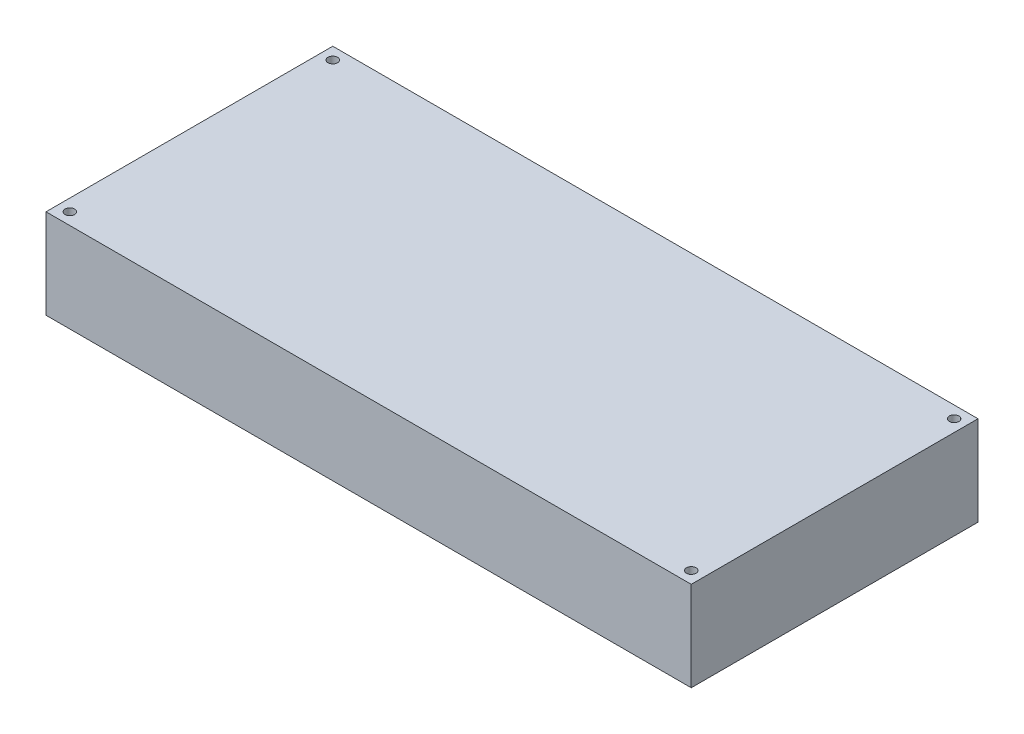
ISO-10303-21;
HEADER;
FILE_DESCRIPTION(('STEP AP214'),'2;1');
FILE_NAME('part.step','',(''),(''),'','','');
FILE_SCHEMA(('AUTOMOTIVE_DESIGN { 1 0 10303 214 1 1 1 1 }'));
ENDSEC;
DATA;
#1=APPLICATION_CONTEXT('core data for automotive mechanical design processes');
#2=APPLICATION_PROTOCOL_DEFINITION('international standard','automotive_design',2000,#1);
#3=PRODUCT_CONTEXT('',#1,'mechanical');
#4=PRODUCT('Part','Part','',(#3));
#5=PRODUCT_RELATED_PRODUCT_CATEGORY('part','',(#4));
#6=PRODUCT_DEFINITION_FORMATION('','',#4);
#7=PRODUCT_DEFINITION_CONTEXT('part definition',#1,'design');
#8=PRODUCT_DEFINITION('design','',#6,#7);
#9=PRODUCT_DEFINITION_SHAPE('','',#8);
#10=(LENGTH_UNIT() NAMED_UNIT(*) SI_UNIT(.MILLI.,.METRE.));
#11=(NAMED_UNIT(*) PLANE_ANGLE_UNIT() SI_UNIT($,.RADIAN.));
#12=(NAMED_UNIT(*) SI_UNIT($,.STERADIAN.) SOLID_ANGLE_UNIT());
#13=UNCERTAINTY_MEASURE_WITH_UNIT(LENGTH_MEASURE(1.E-05),#10,'distance_accuracy_value','');
#14=(GEOMETRIC_REPRESENTATION_CONTEXT(3) GLOBAL_UNCERTAINTY_ASSIGNED_CONTEXT((#13)) GLOBAL_UNIT_ASSIGNED_CONTEXT((#10,
#11,#12)) REPRESENTATION_CONTEXT('',''));
#15=CARTESIAN_POINT('',(0.,0.,0.));
#16=DIRECTION('',(0.,0.,1.));
#17=DIRECTION('',(1.,0.,0.));
#18=AXIS2_PLACEMENT_3D('',#15,#16,#17);
#19=CARTESIAN_POINT('',(0.,15.,0.));
#20=DIRECTION('',(0.,1.,0.));
#21=DIRECTION('',(0.,0.,1.));
#22=AXIS2_PLACEMENT_3D('',#19,#20,#21);
#23=PLANE('',#22);
#24=CARTESIAN_POINT('',(52.,15.,22.));
#25=DIRECTION('',(0.,1.,0.));
#26=DIRECTION('',(0.,0.,1.));
#27=AXIS2_PLACEMENT_3D('',#24,#25,#26);
#28=CIRCLE('',#27,0.802985818753718);
#29=CARTESIAN_POINT('',(52.,15.,22.8029858187537));
#30=VERTEX_POINT('',#29);
#31=EDGE_CURVE('E125',#30,#30,#28,.T.);
#32=ORIENTED_EDGE('',*,*,#31,.F.);
#33=EDGE_LOOP('',(#32));
#34=FACE_BOUND('',#33,.T.);
#35=CARTESIAN_POINT('',(-52.,15.,-22.));
#36=DIRECTION('',(0.,1.,0.));
#37=DIRECTION('',(0.,0.,1.));
#38=AXIS2_PLACEMENT_3D('',#35,#36,#37);
#39=CIRCLE('',#38,0.802985818753718);
#40=CARTESIAN_POINT('',(-52.,15.,-21.1970141812463));
#41=VERTEX_POINT('',#40);
#42=EDGE_CURVE('E104',#41,#41,#39,.T.);
#43=ORIENTED_EDGE('',*,*,#42,.F.);
#44=EDGE_LOOP('',(#43));
#45=FACE_BOUND('',#44,.T.);
#46=DIRECTION('',(0.,0.,-1.));
#47=VECTOR('',#46,1.);
#48=CARTESIAN_POINT('',(54.,15.,-24.));
#49=LINE('',#48,#47);
#50=CARTESIAN_POINT('',(54.,15.,24.));
#51=VERTEX_POINT('',#50);
#52=CARTESIAN_POINT('',(54.,15.,-24.));
#53=VERTEX_POINT('',#52);
#54=EDGE_CURVE('E89',#51,#53,#49,.T.);
#55=ORIENTED_EDGE('',*,*,#54,.T.);
#56=DIRECTION('',(-1.,0.,0.));
#57=VECTOR('',#56,1.);
#58=CARTESIAN_POINT('',(-54.,15.,-24.));
#59=LINE('',#58,#57);
#60=CARTESIAN_POINT('',(-54.,15.,-24.));
#61=VERTEX_POINT('',#60);
#62=EDGE_CURVE('E84',#53,#61,#59,.T.);
#63=ORIENTED_EDGE('',*,*,#62,.T.);
#64=DIRECTION('',(0.,0.,1.));
#65=VECTOR('',#64,1.);
#66=CARTESIAN_POINT('',(-54.,15.,-24.));
#67=LINE('',#66,#65);
#68=CARTESIAN_POINT('',(-54.,15.,24.));
#69=VERTEX_POINT('',#68);
#70=EDGE_CURVE('E87',#61,#69,#67,.T.);
#71=ORIENTED_EDGE('',*,*,#70,.T.);
#72=DIRECTION('',(1.,0.,0.));
#73=VECTOR('',#72,1.);
#74=CARTESIAN_POINT('',(-54.,15.,24.));
#75=LINE('',#74,#73);
#76=EDGE_CURVE('E54',#69,#51,#75,.T.);
#77=ORIENTED_EDGE('',*,*,#76,.T.);
#78=EDGE_LOOP('',(#55,#63,#71,#77));
#79=FACE_BOUND('',#78,.T.);
#80=CARTESIAN_POINT('',(-52.,15.,22.));
#81=DIRECTION('',(0.,1.,0.));
#82=DIRECTION('',(0.,0.,-1.));
#83=AXIS2_PLACEMENT_3D('',#80,#81,#82);
#84=CIRCLE('',#83,0.802985818753718);
#85=CARTESIAN_POINT('',(-52.,15.,21.1970141812463));
#86=VERTEX_POINT('',#85);
#87=EDGE_CURVE('E119',#86,#86,#84,.T.);
#88=ORIENTED_EDGE('',*,*,#87,.F.);
#89=EDGE_LOOP('',(#88));
#90=FACE_BOUND('',#89,.T.);
#91=CARTESIAN_POINT('',(52.,15.,-22.));
#92=DIRECTION('',(0.,1.,0.));
#93=DIRECTION('',(0.,0.,-1.));
#94=AXIS2_PLACEMENT_3D('',#91,#92,#93);
#95=CIRCLE('',#94,0.802985818753718);
#96=CARTESIAN_POINT('',(52.,15.,-22.8029858187537));
#97=VERTEX_POINT('',#96);
#98=EDGE_CURVE('E131',#97,#97,#95,.T.);
#99=ORIENTED_EDGE('',*,*,#98,.F.);
#100=EDGE_LOOP('',(#99));
#101=FACE_BOUND('',#100,.T.);
#102=ADVANCED_FACE('F37',(#34,#45,#79,#90,#101),#23,.T.);
#103=CARTESIAN_POINT('',(0.,0.,0.));
#104=DIRECTION('',(0.,1.,0.));
#105=DIRECTION('',(0.,0.,1.));
#106=AXIS2_PLACEMENT_3D('',#103,#104,#105);
#107=PLANE('',#106);
#108=DIRECTION('',(0.,0.,-1.));
#109=VECTOR('',#108,1.);
#110=CARTESIAN_POINT('',(54.,0.,-24.));
#111=LINE('',#110,#109);
#112=CARTESIAN_POINT('',(54.,0.,24.));
#113=VERTEX_POINT('',#112);
#114=CARTESIAN_POINT('',(54.,0.,-24.));
#115=VERTEX_POINT('',#114);
#116=EDGE_CURVE('E101',#113,#115,#111,.T.);
#117=ORIENTED_EDGE('',*,*,#116,.F.);
#118=DIRECTION('',(1.,0.,0.));
#119=VECTOR('',#118,1.);
#120=CARTESIAN_POINT('',(-54.,0.,24.));
#121=LINE('',#120,#119);
#122=CARTESIAN_POINT('',(-54.,0.,24.));
#123=VERTEX_POINT('',#122);
#124=EDGE_CURVE('E77',#123,#113,#121,.T.);
#125=ORIENTED_EDGE('',*,*,#124,.F.);
#126=DIRECTION('',(0.,0.,1.));
#127=VECTOR('',#126,1.);
#128=CARTESIAN_POINT('',(-54.,0.,-24.));
#129=LINE('',#128,#127);
#130=CARTESIAN_POINT('',(-54.,0.,-24.));
#131=VERTEX_POINT('',#130);
#132=EDGE_CURVE('E71',#131,#123,#129,.T.);
#133=ORIENTED_EDGE('',*,*,#132,.F.);
#134=DIRECTION('',(-1.,0.,0.));
#135=VECTOR('',#134,1.);
#136=CARTESIAN_POINT('',(-54.,0.,-24.));
#137=LINE('',#136,#135);
#138=EDGE_CURVE('E93',#115,#131,#137,.T.);
#139=ORIENTED_EDGE('',*,*,#138,.F.);
#140=EDGE_LOOP('',(#117,#125,#133,#139));
#141=FACE_BOUND('',#140,.T.);
#142=CARTESIAN_POINT('',(-52.,0.,-22.));
#143=DIRECTION('',(0.,1.,0.));
#144=DIRECTION('',(0.,0.,1.));
#145=AXIS2_PLACEMENT_3D('',#142,#143,#144);
#146=CIRCLE('',#145,0.802985818753718);
#147=CARTESIAN_POINT('',(-52.,0.,-21.1970141812463));
#148=VERTEX_POINT('',#147);
#149=EDGE_CURVE('E116',#148,#148,#146,.T.);
#150=ORIENTED_EDGE('',*,*,#149,.T.);
#151=EDGE_LOOP('',(#150));
#152=FACE_BOUND('',#151,.T.);
#153=CARTESIAN_POINT('',(-52.,0.,22.));
#154=DIRECTION('',(0.,1.,0.));
#155=DIRECTION('',(0.,0.,-1.));
#156=AXIS2_PLACEMENT_3D('',#153,#154,#155);
#157=CIRCLE('',#156,0.802985818753718);
#158=CARTESIAN_POINT('',(-52.,0.,21.1970141812463));
#159=VERTEX_POINT('',#158);
#160=EDGE_CURVE('E122',#159,#159,#157,.T.);
#161=ORIENTED_EDGE('',*,*,#160,.T.);
#162=EDGE_LOOP('',(#161));
#163=FACE_BOUND('',#162,.T.);
#164=CARTESIAN_POINT('',(52.,0.,22.));
#165=DIRECTION('',(0.,1.,0.));
#166=DIRECTION('',(0.,0.,1.));
#167=AXIS2_PLACEMENT_3D('',#164,#165,#166);
#168=CIRCLE('',#167,0.802985818753718);
#169=CARTESIAN_POINT('',(52.,0.,22.8029858187537));
#170=VERTEX_POINT('',#169);
#171=EDGE_CURVE('E128',#170,#170,#168,.T.);
#172=ORIENTED_EDGE('',*,*,#171,.T.);
#173=EDGE_LOOP('',(#172));
#174=FACE_BOUND('',#173,.T.);
#175=CARTESIAN_POINT('',(52.,0.,-22.));
#176=DIRECTION('',(0.,1.,0.));
#177=DIRECTION('',(0.,0.,-1.));
#178=AXIS2_PLACEMENT_3D('',#175,#176,#177);
#179=CIRCLE('',#178,0.802985818753718);
#180=CARTESIAN_POINT('',(52.,0.,-22.8029858187537));
#181=VERTEX_POINT('',#180);
#182=EDGE_CURVE('E134',#181,#181,#179,.T.);
#183=ORIENTED_EDGE('',*,*,#182,.T.);
#184=EDGE_LOOP('',(#183));
#185=FACE_BOUND('',#184,.T.);
#186=ADVANCED_FACE('F112',(#141,#152,#163,#174,#185),#107,.F.);
#187=CARTESIAN_POINT('',(54.,15.,-24.));
#188=DIRECTION('',(-1.,0.,0.));
#189=DIRECTION('',(0.,0.,1.));
#190=AXIS2_PLACEMENT_3D('',#187,#188,#189);
#191=PLANE('',#190);
#192=ORIENTED_EDGE('',*,*,#116,.T.);
#193=DIRECTION('',(0.,-1.,0.));
#194=VECTOR('',#193,1.);
#195=CARTESIAN_POINT('',(54.,15.,-24.));
#196=LINE('',#195,#194);
#197=EDGE_CURVE('E11',#53,#115,#196,.T.);
#198=ORIENTED_EDGE('',*,*,#197,.F.);
#199=ORIENTED_EDGE('',*,*,#54,.F.);
#200=DIRECTION('',(0.,-1.,0.));
#201=VECTOR('',#200,1.);
#202=CARTESIAN_POINT('',(54.,15.,24.));
#203=LINE('',#202,#201);
#204=EDGE_CURVE('E97',#51,#113,#203,.T.);
#205=ORIENTED_EDGE('',*,*,#204,.T.);
#206=EDGE_LOOP('',(#192,#198,#199,#205));
#207=FACE_BOUND('',#206,.T.);
#208=ADVANCED_FACE('F39',(#207),#191,.F.);
#209=CARTESIAN_POINT('',(-54.,15.,-24.));
#210=DIRECTION('',(0.,0.,1.));
#211=DIRECTION('',(1.,0.,0.));
#212=AXIS2_PLACEMENT_3D('',#209,#210,#211);
#213=PLANE('',#212);
#214=ORIENTED_EDGE('',*,*,#138,.T.);
#215=DIRECTION('',(0.,-1.,0.));
#216=VECTOR('',#215,1.);
#217=CARTESIAN_POINT('',(-54.,15.,-24.));
#218=LINE('',#217,#216);
#219=EDGE_CURVE('E46',#61,#131,#218,.T.);
#220=ORIENTED_EDGE('',*,*,#219,.F.);
#221=ORIENTED_EDGE('',*,*,#62,.F.);
#222=ORIENTED_EDGE('',*,*,#197,.T.);
#223=EDGE_LOOP('',(#214,#220,#221,#222));
#224=FACE_BOUND('',#223,.T.);
#225=ADVANCED_FACE('F92',(#224),#213,.F.);
#226=CARTESIAN_POINT('',(-54.,15.,-24.));
#227=DIRECTION('',(1.,0.,0.));
#228=DIRECTION('',(0.,0.,-1.));
#229=AXIS2_PLACEMENT_3D('',#226,#227,#228);
#230=PLANE('',#229);
#231=ORIENTED_EDGE('',*,*,#132,.T.);
#232=DIRECTION('',(0.,-1.,0.));
#233=VECTOR('',#232,1.);
#234=CARTESIAN_POINT('',(-54.,15.,24.));
#235=LINE('',#234,#233);
#236=EDGE_CURVE('E94',#69,#123,#235,.T.);
#237=ORIENTED_EDGE('',*,*,#236,.F.);
#238=ORIENTED_EDGE('',*,*,#70,.F.);
#239=ORIENTED_EDGE('',*,*,#219,.T.);
#240=EDGE_LOOP('',(#231,#237,#238,#239));
#241=FACE_BOUND('',#240,.T.);
#242=ADVANCED_FACE('F95',(#241),#230,.F.);
#243=CARTESIAN_POINT('',(-54.,15.,24.));
#244=DIRECTION('',(0.,0.,-1.));
#245=DIRECTION('',(-1.,0.,0.));
#246=AXIS2_PLACEMENT_3D('',#243,#244,#245);
#247=PLANE('',#246);
#248=ORIENTED_EDGE('',*,*,#124,.T.);
#249=ORIENTED_EDGE('',*,*,#204,.F.);
#250=ORIENTED_EDGE('',*,*,#76,.F.);
#251=ORIENTED_EDGE('',*,*,#236,.T.);
#252=EDGE_LOOP('',(#248,#249,#250,#251));
#253=FACE_BOUND('',#252,.T.);
#254=ADVANCED_FACE('F109',(#253),#247,.F.);
#255=CARTESIAN_POINT('',(-52.,15.,-22.));
#256=DIRECTION('',(0.,-1.,0.));
#257=DIRECTION('',(0.,0.,-1.));
#258=AXIS2_PLACEMENT_3D('',#255,#256,#257);
#259=CYLINDRICAL_SURFACE('',#258,0.802985818753718);
#260=ORIENTED_EDGE('',*,*,#42,.T.);
#261=EDGE_LOOP('',(#260));
#262=FACE_BOUND('',#261,.T.);
#263=ORIENTED_EDGE('',*,*,#149,.F.);
#264=EDGE_LOOP('',(#263));
#265=FACE_BOUND('',#264,.T.);
#266=ADVANCED_FACE('F153',(#262,#265),#259,.F.);
#267=CARTESIAN_POINT('',(-52.,15.,22.));
#268=DIRECTION('',(0.,-1.,0.));
#269=DIRECTION('',(0.,0.,-1.));
#270=AXIS2_PLACEMENT_3D('',#267,#268,#269);
#271=CYLINDRICAL_SURFACE('',#270,0.802985818753718);
#272=ORIENTED_EDGE('',*,*,#87,.T.);
#273=EDGE_LOOP('',(#272));
#274=FACE_BOUND('',#273,.T.);
#275=ORIENTED_EDGE('',*,*,#160,.F.);
#276=EDGE_LOOP('',(#275));
#277=FACE_BOUND('',#276,.T.);
#278=ADVANCED_FACE('F199',(#274,#277),#271,.F.);
#279=CARTESIAN_POINT('',(52.,15.,22.));
#280=DIRECTION('',(0.,-1.,0.));
#281=DIRECTION('',(0.,0.,-1.));
#282=AXIS2_PLACEMENT_3D('',#279,#280,#281);
#283=CYLINDRICAL_SURFACE('',#282,0.802985818753718);
#284=ORIENTED_EDGE('',*,*,#31,.T.);
#285=EDGE_LOOP('',(#284));
#286=FACE_BOUND('',#285,.T.);
#287=ORIENTED_EDGE('',*,*,#171,.F.);
#288=EDGE_LOOP('',(#287));
#289=FACE_BOUND('',#288,.T.);
#290=ADVANCED_FACE('F207',(#286,#289),#283,.F.);
#291=CARTESIAN_POINT('',(52.,15.,-22.));
#292=DIRECTION('',(0.,-1.,0.));
#293=DIRECTION('',(0.,0.,-1.));
#294=AXIS2_PLACEMENT_3D('',#291,#292,#293);
#295=CYLINDRICAL_SURFACE('',#294,0.802985818753718);
#296=ORIENTED_EDGE('',*,*,#98,.T.);
#297=EDGE_LOOP('',(#296));
#298=FACE_BOUND('',#297,.T.);
#299=ORIENTED_EDGE('',*,*,#182,.F.);
#300=EDGE_LOOP('',(#299));
#301=FACE_BOUND('',#300,.T.);
#302=ADVANCED_FACE('F140',(#298,#301),#295,.F.);
#303=CLOSED_SHELL('',(#102,#186,#208,#225,#242,#254,#266,#278,#290,#302));
#304=MANIFOLD_SOLID_BREP('B2',#303);
#305=ADVANCED_BREP_SHAPE_REPRESENTATION('',(#18,#304),#14);
#306=SHAPE_DEFINITION_REPRESENTATION(#9,#305);
ENDSEC;
END-ISO-10303-21;
